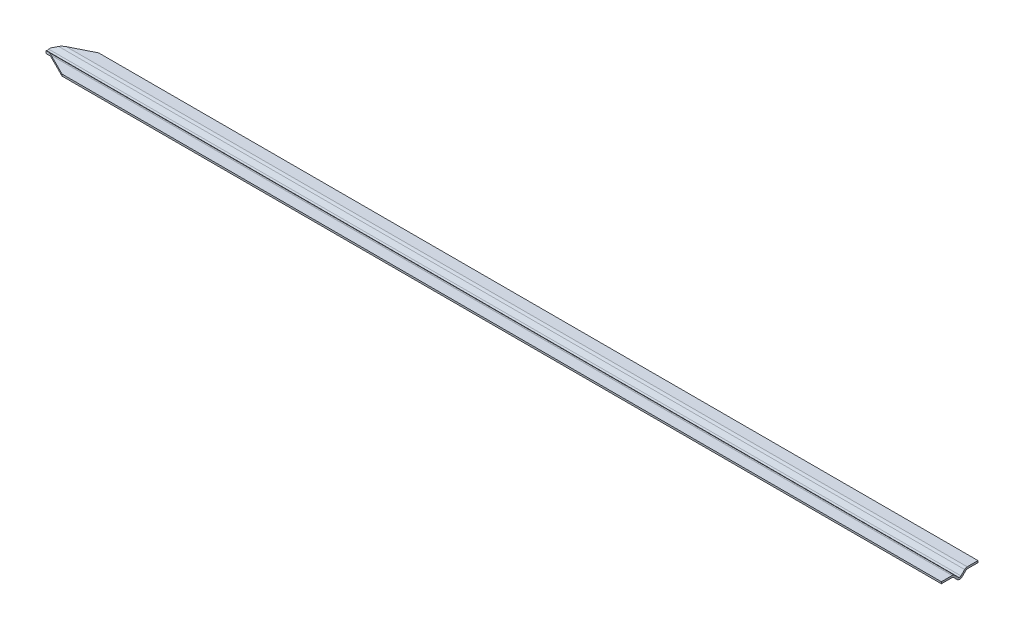
ISO-10303-21;
HEADER;
FILE_DESCRIPTION(('STEP AP214'),'2;1');
FILE_NAME('part.step','',(''),(''),'','','');
FILE_SCHEMA(('AUTOMOTIVE_DESIGN { 1 0 10303 214 1 1 1 1 }'));
ENDSEC;
DATA;
#1=APPLICATION_CONTEXT('core data for automotive mechanical design processes');
#2=APPLICATION_PROTOCOL_DEFINITION('international standard','automotive_design',2000,#1);
#3=PRODUCT_CONTEXT('',#1,'mechanical');
#4=PRODUCT('Part','Part','',(#3));
#5=PRODUCT_RELATED_PRODUCT_CATEGORY('part','',(#4));
#6=PRODUCT_DEFINITION_FORMATION('','',#4);
#7=PRODUCT_DEFINITION_CONTEXT('part definition',#1,'design');
#8=PRODUCT_DEFINITION('design','',#6,#7);
#9=PRODUCT_DEFINITION_SHAPE('','',#8);
#10=(LENGTH_UNIT() NAMED_UNIT(*) SI_UNIT(.MILLI.,.METRE.));
#11=(NAMED_UNIT(*) PLANE_ANGLE_UNIT() SI_UNIT($,.RADIAN.));
#12=(NAMED_UNIT(*) SI_UNIT($,.STERADIAN.) SOLID_ANGLE_UNIT());
#13=UNCERTAINTY_MEASURE_WITH_UNIT(LENGTH_MEASURE(1.E-05),#10,'distance_accuracy_value','');
#14=(GEOMETRIC_REPRESENTATION_CONTEXT(3) GLOBAL_UNCERTAINTY_ASSIGNED_CONTEXT((#13)) GLOBAL_UNIT_ASSIGNED_CONTEXT((#10,
#11,#12)) REPRESENTATION_CONTEXT('',''));
#15=CARTESIAN_POINT('',(0.,0.,0.));
#16=DIRECTION('',(0.,0.,1.));
#17=DIRECTION('',(1.,0.,0.));
#18=AXIS2_PLACEMENT_3D('',#15,#16,#17);
#19=CARTESIAN_POINT('',(-500.,0.,-20.));
#20=DIRECTION('',(0.,0.,-1.));
#21=DIRECTION('',(1.,0.,0.));
#22=AXIS2_PLACEMENT_3D('',#19,#20,#21);
#23=PLANE('',#22);
#24=DIRECTION('',(1.,0.,0.));
#25=VECTOR('',#24,1.);
#26=CARTESIAN_POINT('',(-500.,-1.,-20.));
#27=LINE('',#26,#25);
#28=CARTESIAN_POINT('',(-460.,-0.99999999999989,-20.));
#29=VERTEX_POINT('',#28);
#30=CARTESIAN_POINT('',(500.,-1.,-20.));
#31=VERTEX_POINT('',#30);
#32=EDGE_CURVE('E291',#29,#31,#27,.T.);
#33=ORIENTED_EDGE('',*,*,#32,.F.);
#34=DIRECTION('',(0.,-1.,0.));
#35=VECTOR('',#34,1.);
#36=CARTESIAN_POINT('',(-460.,1258.01941313971,-20.));
#37=LINE('',#36,#35);
#38=CARTESIAN_POINT('',(-460.,0.99999999999989,-20.));
#39=VERTEX_POINT('',#38);
#40=EDGE_CURVE('E184',#39,#29,#37,.T.);
#41=ORIENTED_EDGE('',*,*,#40,.F.);
#42=DIRECTION('',(1.,0.,0.));
#43=VECTOR('',#42,1.);
#44=CARTESIAN_POINT('',(-500.,1.,-20.));
#45=LINE('',#44,#43);
#46=CARTESIAN_POINT('',(500.,1.,-20.));
#47=VERTEX_POINT('',#46);
#48=EDGE_CURVE('E297',#39,#47,#45,.T.);
#49=ORIENTED_EDGE('',*,*,#48,.T.);
#50=DIRECTION('',(0.,-1.,0.));
#51=VECTOR('',#50,1.);
#52=CARTESIAN_POINT('',(500.,0.,-20.));
#53=LINE('',#52,#51);
#54=EDGE_CURVE('E299',#47,#31,#53,.T.);
#55=ORIENTED_EDGE('',*,*,#54,.T.);
#56=EDGE_LOOP('',(#33,#41,#49,#55));
#57=FACE_BOUND('',#56,.T.);
#58=ADVANCED_FACE('F37',(#57),#23,.T.);
#59=CARTESIAN_POINT('',(-500.,0.,20.));
#60=DIRECTION('',(0.,0.,-1.));
#61=DIRECTION('',(1.,0.,0.));
#62=AXIS2_PLACEMENT_3D('',#59,#60,#61);
#63=PLANE('',#62);
#64=DIRECTION('',(1.,0.,0.));
#65=VECTOR('',#64,1.);
#66=CARTESIAN_POINT('',(-500.,1.,20.));
#67=LINE('',#66,#65);
#68=CARTESIAN_POINT('',(-460.,0.99999999999989,20.));
#69=VERTEX_POINT('',#68);
#70=CARTESIAN_POINT('',(500.,1.,20.));
#71=VERTEX_POINT('',#70);
#72=EDGE_CURVE('E281',#69,#71,#67,.T.);
#73=ORIENTED_EDGE('',*,*,#72,.F.);
#74=DIRECTION('',(0.,-1.,0.));
#75=VECTOR('',#74,1.);
#76=CARTESIAN_POINT('',(-460.,1258.01941313971,20.));
#77=LINE('',#76,#75);
#78=CARTESIAN_POINT('',(-460.,-0.99999999999989,20.));
#79=VERTEX_POINT('',#78);
#80=EDGE_CURVE('E282',#69,#79,#77,.T.);
#81=ORIENTED_EDGE('',*,*,#80,.T.);
#82=DIRECTION('',(1.,0.,0.));
#83=VECTOR('',#82,1.);
#84=CARTESIAN_POINT('',(-500.,-1.,20.));
#85=LINE('',#84,#83);
#86=CARTESIAN_POINT('',(500.,-1.,20.));
#87=VERTEX_POINT('',#86);
#88=EDGE_CURVE('E304',#79,#87,#85,.T.);
#89=ORIENTED_EDGE('',*,*,#88,.T.);
#90=DIRECTION('',(0.,-1.,0.));
#91=VECTOR('',#90,1.);
#92=CARTESIAN_POINT('',(500.,0.,20.));
#93=LINE('',#92,#91);
#94=EDGE_CURVE('E285',#71,#87,#93,.T.);
#95=ORIENTED_EDGE('',*,*,#94,.F.);
#96=EDGE_LOOP('',(#73,#81,#89,#95));
#97=FACE_BOUND('',#96,.T.);
#98=ADVANCED_FACE('F243',(#97),#63,.F.);
#99=CARTESIAN_POINT('',(-500.,-1.,20.));
#100=DIRECTION('',(0.,-1.,0.));
#101=DIRECTION('',(0.,0.,-1.));
#102=AXIS2_PLACEMENT_3D('',#99,#100,#101);
#103=PLANE('',#102);
#104=ORIENTED_EDGE('',*,*,#88,.F.);
#105=DIRECTION('',(-0.894427190999916,0.,-0.447213595499958));
#106=VECTOR('',#105,1.);
#107=CARTESIAN_POINT('',(-492.,-1.,4.));
#108=LINE('',#107,#106);
#109=CARTESIAN_POINT('',(-483.514718625761,-1.,8.24264068711927));
#110=VERTEX_POINT('',#109);
#111=EDGE_CURVE('E217',#79,#110,#108,.T.);
#112=ORIENTED_EDGE('',*,*,#111,.T.);
#113=DIRECTION('',(1.,0.,0.));
#114=VECTOR('',#113,1.);
#115=CARTESIAN_POINT('',(500.,-1.,8.24264068711927));
#116=LINE('',#115,#114);
#117=CARTESIAN_POINT('',(500.,-1.,8.24264068711927));
#118=VERTEX_POINT('',#117);
#119=EDGE_CURVE('E309',#110,#118,#116,.T.);
#120=ORIENTED_EDGE('',*,*,#119,.T.);
#121=DIRECTION('',(0.,0.,-1.));
#122=VECTOR('',#121,1.);
#123=CARTESIAN_POINT('',(500.,-1.,20.));
#124=LINE('',#123,#122);
#125=EDGE_CURVE('E355',#87,#118,#124,.T.);
#126=ORIENTED_EDGE('',*,*,#125,.F.);
#127=EDGE_LOOP('',(#104,#112,#120,#126));
#128=FACE_BOUND('',#127,.T.);
#129=ADVANCED_FACE('F239',(#128),#103,.T.);
#130=CARTESIAN_POINT('',(-500.,-0.707106781186547,7.70710678118653));
#131=DIRECTION('',(0.,-0.707106781186547,0.707106781186548));
#132=DIRECTION('',(0.,-0.707106781186548,-0.707106781186547));
#133=AXIS2_PLACEMENT_3D('',#130,#131,#132);
#134=PLANE('',#133);
#135=DIRECTION('',(1.,0.,0.));
#136=VECTOR('',#135,1.);
#137=CARTESIAN_POINT('',(-500.,-1.58578643762691,6.82842712474617));
#138=LINE('',#137,#136);
#139=CARTESIAN_POINT('',(500.,-1.58578643762691,6.82842712474617));
#140=VERTEX_POINT('',#139);
#141=CARTESIAN_POINT('',(-486.343145750508,-1.58578643762691,6.82842712474617));
#142=VERTEX_POINT('',#141);
#143=EDGE_CURVE('E311',#140,#142,#138,.F.);
#144=ORIENTED_EDGE('',*,*,#143,.T.);
#145=DIRECTION('',(-0.816496580927725,-0.408248290463864,-0.408248290463863));
#146=VECTOR('',#145,1.);
#147=CARTESIAN_POINT('',(-494.861928812542,-5.84517796864424,2.56903559372885));
#148=LINE('',#147,#146);
#149=CARTESIAN_POINT('',(-494.343145750508,-5.5857864376269,2.82842712474619));
#150=VERTEX_POINT('',#149);
#151=EDGE_CURVE('E212',#142,#150,#148,.T.);
#152=ORIENTED_EDGE('',*,*,#151,.T.);
#153=DIRECTION('',(1.,0.,0.));
#154=VECTOR('',#153,1.);
#155=CARTESIAN_POINT('',(-500.,-5.5857864376269,2.82842712474619));
#156=LINE('',#155,#154);
#157=CARTESIAN_POINT('',(500.,-5.5857864376269,2.82842712474619));
#158=VERTEX_POINT('',#157);
#159=EDGE_CURVE('E326',#150,#158,#156,.T.);
#160=ORIENTED_EDGE('',*,*,#159,.T.);
#161=DIRECTION('',(0.,-0.707106781186548,-0.707106781186547));
#162=VECTOR('',#161,1.);
#163=CARTESIAN_POINT('',(500.,-0.707106781186547,7.70710678118653));
#164=LINE('',#163,#162);
#165=EDGE_CURVE('E358',#140,#158,#164,.T.);
#166=ORIENTED_EDGE('',*,*,#165,.F.);
#167=EDGE_LOOP('',(#144,#152,#160,#166));
#168=FACE_BOUND('',#167,.T.);
#169=ADVANCED_FACE('F242',(#168),#134,.T.);
#170=CARTESIAN_POINT('',(-500.,-7.70710678118655,-0.707106781186548));
#171=DIRECTION('',(0.,-0.707106781186547,-0.707106781186548));
#172=DIRECTION('',(0.,0.707106781186548,-0.707106781186547));
#173=AXIS2_PLACEMENT_3D('',#170,#171,#172);
#174=PLANE('',#173);
#175=DIRECTION('',(1.,0.,0.));
#176=VECTOR('',#175,1.);
#177=CARTESIAN_POINT('',(-500.,-5.5857864376269,-2.82842712474619));
#178=LINE('',#177,#176);
#179=CARTESIAN_POINT('',(500.,-5.5857864376269,-2.82842712474619));
#180=VERTEX_POINT('',#179);
#181=CARTESIAN_POINT('',(-494.343145750508,-5.5857864376269,-2.82842712474619));
#182=VERTEX_POINT('',#181);
#183=EDGE_CURVE('E333',#180,#182,#178,.F.);
#184=ORIENTED_EDGE('',*,*,#183,.T.);
#185=DIRECTION('',(0.816496580927725,0.408248290463864,-0.408248290463863));
#186=VECTOR('',#185,1.);
#187=CARTESIAN_POINT('',(-499.528595479209,-8.17851130197758,-0.235702260395514));
#188=LINE('',#187,#186);
#189=CARTESIAN_POINT('',(-486.343145750508,-1.58578643762691,-6.82842712474617));
#190=VERTEX_POINT('',#189);
#191=EDGE_CURVE('E194',#182,#190,#188,.T.);
#192=ORIENTED_EDGE('',*,*,#191,.T.);
#193=DIRECTION('',(1.,0.,0.));
#194=VECTOR('',#193,1.);
#195=CARTESIAN_POINT('',(500.,-1.58578643762691,-6.82842712474617));
#196=LINE('',#195,#194);
#197=CARTESIAN_POINT('',(500.,-1.58578643762691,-6.82842712474617));
#198=VERTEX_POINT('',#197);
#199=EDGE_CURVE('E314',#190,#198,#196,.T.);
#200=ORIENTED_EDGE('',*,*,#199,.T.);
#201=DIRECTION('',(0.,0.707106781186548,-0.707106781186547));
#202=VECTOR('',#201,1.);
#203=CARTESIAN_POINT('',(500.,-7.70710678118655,-0.707106781186548));
#204=LINE('',#203,#202);
#205=EDGE_CURVE('E361',#180,#198,#204,.T.);
#206=ORIENTED_EDGE('',*,*,#205,.F.);
#207=EDGE_LOOP('',(#184,#192,#200,#206));
#208=FACE_BOUND('',#207,.T.);
#209=ADVANCED_FACE('F247',(#208),#174,.T.);
#210=CARTESIAN_POINT('',(-500.,-1.,-6.99999999999998));
#211=DIRECTION('',(0.,-1.,0.));
#212=DIRECTION('',(0.,0.,-1.));
#213=AXIS2_PLACEMENT_3D('',#210,#211,#212);
#214=PLANE('',#213);
#215=DIRECTION('',(1.,0.,0.));
#216=VECTOR('',#215,1.);
#217=CARTESIAN_POINT('',(-500.,-1.,-8.24264068711927));
#218=LINE('',#217,#216);
#219=CARTESIAN_POINT('',(500.,-1.,-8.24264068711927));
#220=VERTEX_POINT('',#219);
#221=CARTESIAN_POINT('',(-483.514718625761,-1.,-8.24264068711927));
#222=VERTEX_POINT('',#221);
#223=EDGE_CURVE('E316',#220,#222,#218,.F.);
#224=ORIENTED_EDGE('',*,*,#223,.T.);
#225=DIRECTION('',(0.894427190999916,0.,-0.447213595499958));
#226=VECTOR('',#225,1.);
#227=CARTESIAN_POINT('',(-497.2,-1.,-1.4));
#228=LINE('',#227,#226);
#229=EDGE_CURVE('E202',#222,#29,#228,.T.);
#230=ORIENTED_EDGE('',*,*,#229,.T.);
#231=ORIENTED_EDGE('',*,*,#32,.T.);
#232=DIRECTION('',(0.,0.,-1.));
#233=VECTOR('',#232,1.);
#234=CARTESIAN_POINT('',(500.,-1.,-6.99999999999998));
#235=LINE('',#234,#233);
#236=EDGE_CURVE('E287',#220,#31,#235,.T.);
#237=ORIENTED_EDGE('',*,*,#236,.F.);
#238=EDGE_LOOP('',(#224,#230,#231,#237));
#239=FACE_BOUND('',#238,.T.);
#240=ADVANCED_FACE('F251',(#239),#214,.T.);
#241=CARTESIAN_POINT('',(-500.,1.,20.));
#242=DIRECTION('',(0.,-1.,0.));
#243=DIRECTION('',(0.,0.,-1.));
#244=AXIS2_PLACEMENT_3D('',#241,#242,#243);
#245=PLANE('',#244);
#246=DIRECTION('',(-0.894427190999916,0.,-0.447213595499958));
#247=VECTOR('',#246,1.);
#248=CARTESIAN_POINT('',(-492.,1.,4.));
#249=LINE('',#248,#247);
#250=CARTESIAN_POINT('',(-483.514718625761,1.,8.24264068711927));
#251=VERTEX_POINT('',#250);
#252=EDGE_CURVE('E207',#69,#251,#249,.T.);
#253=ORIENTED_EDGE('',*,*,#252,.F.);
#254=ORIENTED_EDGE('',*,*,#72,.T.);
#255=DIRECTION('',(0.,0.,-1.));
#256=VECTOR('',#255,1.);
#257=CARTESIAN_POINT('',(500.,1.,20.));
#258=LINE('',#257,#256);
#259=CARTESIAN_POINT('',(500.,1.,8.24264068711927));
#260=VERTEX_POINT('',#259);
#261=EDGE_CURVE('E288',#71,#260,#258,.T.);
#262=ORIENTED_EDGE('',*,*,#261,.T.);
#263=DIRECTION('',(1.,0.,0.));
#264=VECTOR('',#263,1.);
#265=CARTESIAN_POINT('',(-500.,1.,8.24264068711927));
#266=LINE('',#265,#264);
#267=EDGE_CURVE('E338',#260,#251,#266,.F.);
#268=ORIENTED_EDGE('',*,*,#267,.T.);
#269=EDGE_LOOP('',(#253,#254,#262,#268));
#270=FACE_BOUND('',#269,.T.);
#271=ADVANCED_FACE('F255',(#270),#245,.F.);
#272=CARTESIAN_POINT('',(-500.,0.707106781186547,6.29289321881343));
#273=DIRECTION('',(0.,-0.707106781186547,0.707106781186548));
#274=DIRECTION('',(0.,-0.707106781186548,-0.707106781186547));
#275=AXIS2_PLACEMENT_3D('',#272,#273,#274);
#276=PLANE('',#275);
#277=CARTESIAN_POINT('',(-493.291796067501,-5.58578643762697,0.));
#278=DIRECTION('',(0.,-0.707106781186547,0.707106781186548));
#279=DIRECTION('',(0.,-0.707106781186548,-0.707106781186547));
#280=AXIS2_PLACEMENT_3D('',#277,#278,#279);
#281=ELLIPSE('',#280,4.24264068711933,3.00000000000003);
#282=CARTESIAN_POINT('',(-494.633436854001,-2.90250486462728,2.68328157299975));
#283=VERTEX_POINT('',#282);
#284=CARTESIAN_POINT('',(-495.937547378565,-4.1715728752538,1.4142135623731));
#285=VERTEX_POINT('',#284);
#286=EDGE_CURVE('E179',#283,#285,#281,.T.);
#287=ORIENTED_EDGE('',*,*,#286,.F.);
#288=DIRECTION('',(-0.816496580927725,-0.408248290463864,-0.408248290463863));
#289=VECTOR('',#288,1.);
#290=CARTESIAN_POINT('',(-495.804737854124,-3.48815536468908,2.09763107293781));
#291=LINE('',#290,#289);
#292=CARTESIAN_POINT('',(-489.171572875254,-0.171572875253814,5.41421356237308));
#293=VERTEX_POINT('',#292);
#294=EDGE_CURVE('E205',#293,#283,#291,.T.);
#295=ORIENTED_EDGE('',*,*,#294,.F.);
#296=DIRECTION('',(1.,0.,0.));
#297=VECTOR('',#296,1.);
#298=CARTESIAN_POINT('',(-500.,-0.171572875253814,5.41421356237308));
#299=LINE('',#298,#297);
#300=CARTESIAN_POINT('',(500.,-0.171572875253814,5.41421356237308));
#301=VERTEX_POINT('',#300);
#302=EDGE_CURVE('E336',#293,#301,#299,.T.);
#303=ORIENTED_EDGE('',*,*,#302,.T.);
#304=DIRECTION('',(0.,-0.707106781186548,-0.707106781186547));
#305=VECTOR('',#304,1.);
#306=CARTESIAN_POINT('',(500.,0.707106781186547,6.29289321881343));
#307=LINE('',#306,#305);
#308=CARTESIAN_POINT('',(500.,-4.1715728752538,1.4142135623731));
#309=VERTEX_POINT('',#308);
#310=EDGE_CURVE('E293',#301,#309,#307,.T.);
#311=ORIENTED_EDGE('',*,*,#310,.T.);
#312=DIRECTION('',(1.,0.,0.));
#313=VECTOR('',#312,1.);
#314=CARTESIAN_POINT('',(-500.,-4.1715728752538,1.4142135623731));
#315=LINE('',#314,#313);
#316=EDGE_CURVE('E306',#309,#285,#315,.F.);
#317=ORIENTED_EDGE('',*,*,#316,.T.);
#318=EDGE_LOOP('',(#287,#295,#303,#311,#317));
#319=FACE_BOUND('',#318,.T.);
#320=ADVANCED_FACE('F259',(#319),#276,.F.);
#321=CARTESIAN_POINT('',(-500.,-6.29289321881345,0.707106781186548));
#322=DIRECTION('',(0.,-0.707106781186547,-0.707106781186548));
#323=DIRECTION('',(0.,0.707106781186548,-0.707106781186547));
#324=AXIS2_PLACEMENT_3D('',#321,#322,#323);
#325=PLANE('',#324);
#326=DIRECTION('',(0.816496580927725,0.408248290463864,-0.408248290463863));
#327=VECTOR('',#326,1.);
#328=CARTESIAN_POINT('',(-500.471404520791,-5.82148869802242,0.235702260395519));
#329=LINE('',#328,#327);
#330=CARTESIAN_POINT('',(-494.633436854,-2.90250486462718,-2.68328157299977));
#331=VERTEX_POINT('',#330);
#332=CARTESIAN_POINT('',(-489.171572875254,-0.171572875253814,-5.41421356237308));
#333=VERTEX_POINT('',#332);
#334=EDGE_CURVE('E58',#331,#333,#329,.T.);
#335=ORIENTED_EDGE('',*,*,#334,.F.);
#336=CARTESIAN_POINT('',(-493.291796067501,-5.58578643762697,0.));
#337=DIRECTION('',(0.,-0.707106781186547,-0.707106781186548));
#338=DIRECTION('',(0.,-0.707106781186548,0.707106781186547));
#339=AXIS2_PLACEMENT_3D('',#336,#337,#338);
#340=ELLIPSE('',#339,4.24264068711933,3.00000000000003);
#341=CARTESIAN_POINT('',(-495.937547378565,-4.1715728752538,-1.4142135623731));
#342=VERTEX_POINT('',#341);
#343=EDGE_CURVE('E171',#342,#331,#340,.T.);
#344=ORIENTED_EDGE('',*,*,#343,.F.);
#345=DIRECTION('',(1.,0.,0.));
#346=VECTOR('',#345,1.);
#347=CARTESIAN_POINT('',(500.,-4.1715728752538,-1.4142135623731));
#348=LINE('',#347,#346);
#349=CARTESIAN_POINT('',(500.,-4.1715728752538,-1.4142135623731));
#350=VERTEX_POINT('',#349);
#351=EDGE_CURVE('E302',#342,#350,#348,.T.);
#352=ORIENTED_EDGE('',*,*,#351,.T.);
#353=DIRECTION('',(0.,0.707106781186548,-0.707106781186547));
#354=VECTOR('',#353,1.);
#355=CARTESIAN_POINT('',(500.,-6.29289321881345,0.707106781186548));
#356=LINE('',#355,#354);
#357=CARTESIAN_POINT('',(500.,-0.171572875253814,-5.41421356237308));
#358=VERTEX_POINT('',#357);
#359=EDGE_CURVE('E368',#350,#358,#356,.T.);
#360=ORIENTED_EDGE('',*,*,#359,.T.);
#361=DIRECTION('',(1.,0.,0.));
#362=VECTOR('',#361,1.);
#363=CARTESIAN_POINT('',(-500.,-0.171572875253814,-5.41421356237308));
#364=LINE('',#363,#362);
#365=EDGE_CURVE('E191',#358,#333,#364,.F.);
#366=ORIENTED_EDGE('',*,*,#365,.T.);
#367=EDGE_LOOP('',(#335,#344,#352,#360,#366));
#368=FACE_BOUND('',#367,.T.);
#369=ADVANCED_FACE('F188',(#368),#325,.F.);
#370=CARTESIAN_POINT('',(-500.,1.,-6.99999999999998));
#371=DIRECTION('',(0.,-1.,0.));
#372=DIRECTION('',(0.,0.,-1.));
#373=AXIS2_PLACEMENT_3D('',#370,#371,#372);
#374=PLANE('',#373);
#375=DIRECTION('',(0.894427190999916,0.,-0.447213595499958));
#376=VECTOR('',#375,1.);
#377=CARTESIAN_POINT('',(-497.2,1.,-1.4));
#378=LINE('',#377,#376);
#379=CARTESIAN_POINT('',(-483.514718625761,1.,-8.24264068711927));
#380=VERTEX_POINT('',#379);
#381=EDGE_CURVE('E192',#380,#39,#378,.T.);
#382=ORIENTED_EDGE('',*,*,#381,.F.);
#383=DIRECTION('',(1.,0.,0.));
#384=VECTOR('',#383,1.);
#385=CARTESIAN_POINT('',(-500.,1.,-8.24264068711927));
#386=LINE('',#385,#384);
#387=CARTESIAN_POINT('',(500.,1.,-8.24264068711927));
#388=VERTEX_POINT('',#387);
#389=EDGE_CURVE('E341',#380,#388,#386,.T.);
#390=ORIENTED_EDGE('',*,*,#389,.T.);
#391=DIRECTION('',(0.,0.,-1.));
#392=VECTOR('',#391,1.);
#393=CARTESIAN_POINT('',(500.,1.,-6.99999999999998));
#394=LINE('',#393,#392);
#395=EDGE_CURVE('E369',#388,#47,#394,.T.);
#396=ORIENTED_EDGE('',*,*,#395,.T.);
#397=ORIENTED_EDGE('',*,*,#48,.F.);
#398=EDGE_LOOP('',(#382,#390,#396,#397));
#399=FACE_BOUND('',#398,.T.);
#400=ADVANCED_FACE('F266',(#399),#374,.F.);
#401=CARTESIAN_POINT('',(-500.,-2.75735931288071,0.));
#402=DIRECTION('',(-1.,0.,0.));
#403=DIRECTION('',(0.,0.,1.));
#404=AXIS2_PLACEMENT_3D('',#401,#402,#403);
#405=CYLINDRICAL_SURFACE('',#404,2.);
#406=CARTESIAN_POINT('',(-495.937547378565,-4.1715728752538,1.4142135623731));
#407=CARTESIAN_POINT('',(-495.957723297161,-4.20930799790388,1.37646808999392));
#408=CARTESIAN_POINT('',(-495.977684740593,-4.2455848982313,1.33717838352032));
#409=CARTESIAN_POINT('',(-496.016800254544,-4.31507554483248,1.25554961252144));
#410=CARTESIAN_POINT('',(-496.035953733113,-4.34828706573443,1.21320837177433));
#411=CARTESIAN_POINT('',(-496.091833613438,-4.44343906416258,1.08117595074418));
#412=CARTESIAN_POINT('',(-496.126703994421,-4.50039646375513,0.986973412628392));
#413=CARTESIAN_POINT('',(-496.188398607626,-4.59904143321139,0.787790797351582));
#414=CARTESIAN_POINT('',(-496.215182926196,-4.64065347329479,0.682760583144709));
#415=CARTESIAN_POINT('',(-496.257531785287,-4.70574424617022,0.46538391593548));
#416=CARTESIAN_POINT('',(-496.273138038778,-4.7292904186943,0.353066387184212));
#417=CARTESIAN_POINT('',(-496.290287594897,-4.75511482251872,0.138635844907319));
#418=CARTESIAN_POINT('',(-496.293284438429,-4.75959209063838,0.0369007007344669));
#419=CARTESIAN_POINT('',(-496.288920919191,-4.75304606859646,-0.165894493081308));
#420=CARTESIAN_POINT('',(-496.281556767717,-4.74201710827607,-0.266954282187833));
#421=CARTESIAN_POINT('',(-496.258104270704,-4.7064984955943,-0.457816498489173));
#422=CARTESIAN_POINT('',(-496.24269225465,-4.6830505850522,-0.547902087008158));
#423=CARTESIAN_POINT('',(-496.204832212706,-4.62451689059015,-0.722648032734442));
#424=CARTESIAN_POINT('',(-496.18238085284,-4.58942559166536,-0.807305796281815));
#425=CARTESIAN_POINT('',(-496.129908164917,-4.5055130112524,-0.976533840593393));
#426=CARTESIAN_POINT('',(-496.099410621093,-4.45578858188332,-1.06050409933128));
#427=CARTESIAN_POINT('',(-496.034228189167,-4.34572454412712,-1.21918489677028));
#428=CARTESIAN_POINT('',(-495.99954825886,-4.28539746603746,-1.29390619026288));
#429=CARTESIAN_POINT('',(-495.955202633419,-4.20439386422946,-1.38081153760543));
#430=CARTESIAN_POINT('',(-495.946393690875,-4.18812034760624,-1.39766586340613));
#431=CARTESIAN_POINT('',(-495.937547378565,-4.1715728752538,-1.4142135623731));
#432=B_SPLINE_CURVE_WITH_KNOTS('',3,(#406,#407,#408,#409,#410,#411,#412,#413,#414,#415,#416,
#417,#418,#419,#420,#421,#422,#423,#424,#425,#426,#427,#428,#429,#430,#431),.UNSPECIFIED.,.F.,
.F.,(4,2,2,2,2,2,2,2,2,2,2,2,4),(0.,0.171094016347221,0.342311280518857,0.686993291106532,
1.03334987023094,1.37840712632449,1.6823675563354,1.98643916439638,2.2683067262671,
2.55030798851123,2.85590511480023,3.16114348306743,3.23621656431459),.UNSPECIFIED.);
#433=EDGE_CURVE('E176',#285,#342,#432,.T.);
#434=ORIENTED_EDGE('',*,*,#433,.F.);
#435=ORIENTED_EDGE('',*,*,#316,.F.);
#436=CARTESIAN_POINT('',(500.,-2.75735931288071,0.));
#437=DIRECTION('',(-1.,0.,0.));
#438=DIRECTION('',(0.,0.,1.));
#439=AXIS2_PLACEMENT_3D('',#436,#437,#438);
#440=CIRCLE('',#439,2.);
#441=EDGE_CURVE('E319',#350,#309,#440,.T.);
#442=ORIENTED_EDGE('',*,*,#441,.F.);
#443=ORIENTED_EDGE('',*,*,#351,.F.);
#444=EDGE_LOOP('',(#434,#435,#442,#443));
#445=FACE_BOUND('',#444,.T.);
#446=ADVANCED_FACE('F226',(#445),#405,.F.);
#447=CARTESIAN_POINT('',(-500.,-3.,8.24264068711927));
#448=DIRECTION('',(-1.,0.,0.));
#449=DIRECTION('',(0.,0.,1.));
#450=AXIS2_PLACEMENT_3D('',#447,#448,#449);
#451=CYLINDRICAL_SURFACE('',#450,2.);
#452=CARTESIAN_POINT('',(-483.514718625761,-3.,8.24264068711927));
#453=DIRECTION('',(-0.447213595499958,0.,0.894427190999916));
#454=DIRECTION('',(-0.894427190999916,0.,-0.447213595499958));
#455=AXIS2_PLACEMENT_3D('',#452,#453,#454);
#456=ELLIPSE('',#455,4.47213595499958,2.);
#457=EDGE_CURVE('E215',#142,#110,#456,.F.);
#458=ORIENTED_EDGE('',*,*,#457,.F.);
#459=ORIENTED_EDGE('',*,*,#143,.F.);
#460=CARTESIAN_POINT('',(500.,-3.,8.24264068711927));
#461=DIRECTION('',(-1.,0.,0.));
#462=DIRECTION('',(0.,0.,1.));
#463=AXIS2_PLACEMENT_3D('',#460,#461,#462);
#464=CIRCLE('',#463,2.);
#465=EDGE_CURVE('E322',#118,#140,#464,.T.);
#466=ORIENTED_EDGE('',*,*,#465,.F.);
#467=ORIENTED_EDGE('',*,*,#119,.F.);
#468=EDGE_LOOP('',(#458,#459,#466,#467));
#469=FACE_BOUND('',#468,.T.);
#470=ADVANCED_FACE('F398',(#469),#451,.F.);
#471=CARTESIAN_POINT('',(-500.,-3.,-8.24264068711927));
#472=DIRECTION('',(-1.,0.,0.));
#473=DIRECTION('',(0.,0.,1.));
#474=AXIS2_PLACEMENT_3D('',#471,#472,#473);
#475=CYLINDRICAL_SURFACE('',#474,2.);
#476=CARTESIAN_POINT('',(-483.514718625761,-3.,-8.24264068711927));
#477=DIRECTION('',(-0.447213595499958,0.,-0.894427190999916));
#478=DIRECTION('',(-0.894427190999916,0.,0.447213595499958));
#479=AXIS2_PLACEMENT_3D('',#476,#477,#478);
#480=ELLIPSE('',#479,4.47213595499958,2.);
#481=EDGE_CURVE('E200',#222,#190,#480,.F.);
#482=ORIENTED_EDGE('',*,*,#481,.F.);
#483=ORIENTED_EDGE('',*,*,#223,.F.);
#484=CARTESIAN_POINT('',(500.,-3.,-8.24264068711927));
#485=DIRECTION('',(-1.,0.,0.));
#486=DIRECTION('',(0.,0.,1.));
#487=AXIS2_PLACEMENT_3D('',#484,#485,#486);
#488=CIRCLE('',#487,2.);
#489=EDGE_CURVE('E324',#198,#220,#488,.T.);
#490=ORIENTED_EDGE('',*,*,#489,.F.);
#491=ORIENTED_EDGE('',*,*,#199,.F.);
#492=EDGE_LOOP('',(#482,#483,#490,#491));
#493=FACE_BOUND('',#492,.T.);
#494=ADVANCED_FACE('F404',(#493),#475,.F.);
#495=CARTESIAN_POINT('',(-500.,-2.75735931288071,0.));
#496=DIRECTION('',(1.,0.,0.));
#497=DIRECTION('',(0.,0.,-1.));
#498=AXIS2_PLACEMENT_3D('',#495,#496,#497);
#499=CYLINDRICAL_SURFACE('',#498,4.);
#500=CARTESIAN_POINT('',(-494.633436854,-5.72383870771893,2.68328157299977));
#501=CARTESIAN_POINT('',(-494.715002622562,-5.76077218313878,2.64247211538646));
#502=CARTESIAN_POINT('',(-494.794146883328,-5.79919971721772,2.59827589772774));
#503=CARTESIAN_POINT('',(-494.947506266393,-5.87777088265218,2.50335625454541));
#504=CARTESIAN_POINT('',(-495.021722064006,-5.91791427765064,2.45263372608796));
#505=CARTESIAN_POINT('',(-495.165819958761,-5.99902700188727,2.34440136762551));
#506=CARTESIAN_POINT('',(-495.235655959698,-6.04000053113003,2.28683344458378));
#507=CARTESIAN_POINT('',(-495.370051406592,-6.12132707530982,2.16542318207985));
#508=CARTESIAN_POINT('',(-495.434610556632,-6.1616800553447,2.10158049118149));
#509=CARTESIAN_POINT('',(-495.558223153258,-6.24081116174313,1.96764409665909));
#510=CARTESIAN_POINT('',(-495.617268068992,-6.27958679721958,1.89754102516189));
#511=CARTESIAN_POINT('',(-495.729273485981,-6.35451994668048,1.75133727143329));
#512=CARTESIAN_POINT('',(-495.782235079292,-6.39067793014406,1.67523766982571));
#513=CARTESIAN_POINT('',(-495.881307295705,-6.4592908221034,1.51758329930309));
#514=CARTESIAN_POINT('',(-495.92744409499,-6.49175976234274,1.43605121027774));
#515=CARTESIAN_POINT('',(-496.012409628782,-6.55220439038304,1.26773535452009));
#516=CARTESIAN_POINT('',(-496.05124152706,-6.58018202260712,1.18095388293));
#517=CARTESIAN_POINT('',(-496.135948537419,-6.6416888677481,0.96412761308472));
#518=CARTESIAN_POINT('',(-496.177627300975,-6.67240064866376,0.831579057875664));
#519=CARTESIAN_POINT('',(-496.242433079159,-6.72041175583255,0.559693177473482));
#520=CARTESIAN_POINT('',(-496.265567527363,-6.7377164562842,0.420358596273561));
#521=CARTESIAN_POINT('',(-496.291957765163,-6.757470661654,0.138320834523591));
#522=CARTESIAN_POINT('',(-496.295155435835,-6.75987673452919,-0.00439097847765716));
#523=CARTESIAN_POINT('',(-496.281295268575,-6.7494872137728,-0.28826268828161));
#524=CARTESIAN_POINT('',(-496.264235447145,-6.73669013153407,-0.429422431748479));
#525=CARTESIAN_POINT('',(-496.212143603856,-6.69793610376558,-0.699780572691161));
#526=CARTESIAN_POINT('',(-496.177945577119,-6.6725904433339,-0.829231704526414));
#527=CARTESIAN_POINT('',(-496.093756339135,-6.61095002903264,-1.0800632229783));
#528=CARTESIAN_POINT('',(-496.043763595678,-6.57465421292761,-1.20144282520998));
#529=CARTESIAN_POINT('',(-495.924318037764,-6.48941609016781,-1.44571330438409));
#530=CARTESIAN_POINT('',(-495.85344002044,-6.43958401698732,-1.56759059293953));
#531=CARTESIAN_POINT('',(-495.697162646992,-6.33262684939705,-1.798238644975));
#532=CARTESIAN_POINT('',(-495.611743597069,-6.27549189074723,-1.90699128699305));
#533=CARTESIAN_POINT('',(-495.410231087528,-6.14567590720773,-2.1305185131452));
#534=CARTESIAN_POINT('',(-495.291404662496,-6.07213718914377,-2.24232540299463));
#535=CARTESIAN_POINT('',(-495.037400643307,-5.92537574070999,-2.44525161857304));
#536=CARTESIAN_POINT('',(-494.902256321314,-5.85215267239934,-2.53641198589232));
#537=CARTESIAN_POINT('',(-494.717964396449,-5.7628056608574,-2.63974601060945));
#538=CARTESIAN_POINT('',(-494.676023347442,-5.74311417997336,-2.66198050761981));
#539=CARTESIAN_POINT('',(-494.633436854,-5.72383870771896,-2.68328157299981));
#540=B_SPLINE_CURVE_WITH_KNOTS('',3,(#500,#501,#502,#503,#504,#505,#506,#507,#508,#509,#510,
#511,#512,#513,#514,#515,#516,#517,#518,#519,#520,#521,#522,#523,#524,#525,#526,#527,#528,#529,
#530,#531,#532,#533,#534,#535,#536,#537,#538,#539),.UNSPECIFIED.,.F.,.F.,(4,2,2,2,2,2,2,2,2,2,2,
2,2,2,2,2,2,2,2,4),(0.,0.295040353006456,0.590040194835903,0.887751163934453,1.18547881669246,
1.48365969560421,1.78178696223152,2.07873935185104,2.37556283305606,2.80052502760093,
3.22531678873115,3.65134630960944,4.0774175483324,4.48451879106474,4.89165953793781,
5.33862624186996,5.78620318740336,6.32113942696227,6.85500278922134,7.00912882715795),.UNSPECIFIED.);
#541=CARTESIAN_POINT('',(-494.633436854,-5.72383870771898,2.68328157299977));
#542=VERTEX_POINT('',#541);
#543=CARTESIAN_POINT('',(-494.633436854,-5.72383870771893,-2.68328157299977));
#544=VERTEX_POINT('',#543);
#545=EDGE_CURVE('E11',#542,#544,#540,.T.);
#546=ORIENTED_EDGE('',*,*,#545,.T.);
#547=CARTESIAN_POINT('',(-500.,-2.75735931288071,0.));
#548=DIRECTION('',(-0.447213595499958,0.,-0.894427190999916));
#549=DIRECTION('',(0.894427190999916,0.,-0.447213595499958));
#550=AXIS2_PLACEMENT_3D('',#547,#548,#549);
#551=ELLIPSE('',#550,8.94427190999915,4.);
#552=EDGE_CURVE('E183',#544,#182,#551,.F.);
#553=ORIENTED_EDGE('',*,*,#552,.T.);
#554=ORIENTED_EDGE('',*,*,#183,.F.);
#555=CARTESIAN_POINT('',(500.,-2.75735931288071,0.));
#556=DIRECTION('',(-1.,0.,0.));
#557=DIRECTION('',(0.,0.,1.));
#558=AXIS2_PLACEMENT_3D('',#555,#556,#557);
#559=CIRCLE('',#558,4.);
#560=EDGE_CURVE('E331',#158,#180,#559,.F.);
#561=ORIENTED_EDGE('',*,*,#560,.F.);
#562=ORIENTED_EDGE('',*,*,#159,.F.);
#563=CARTESIAN_POINT('',(-500.,-2.75735931288071,0.));
#564=DIRECTION('',(-0.447213595499958,0.,0.894427190999916));
#565=DIRECTION('',(0.894427190999916,0.,0.447213595499958));
#566=AXIS2_PLACEMENT_3D('',#563,#564,#565);
#567=ELLIPSE('',#566,8.94427190999915,4.);
#568=EDGE_CURVE('E209',#150,#542,#567,.F.);
#569=ORIENTED_EDGE('',*,*,#568,.T.);
#570=EDGE_LOOP('',(#546,#553,#554,#561,#562,#569));
#571=FACE_BOUND('',#570,.T.);
#572=ADVANCED_FACE('F391',(#571),#499,.T.);
#573=CARTESIAN_POINT('',(-500.,-3.,8.24264068711927));
#574=DIRECTION('',(1.,0.,0.));
#575=DIRECTION('',(0.,0.,-1.));
#576=AXIS2_PLACEMENT_3D('',#573,#574,#575);
#577=CYLINDRICAL_SURFACE('',#576,4.);
#578=ORIENTED_EDGE('',*,*,#302,.F.);
#579=CARTESIAN_POINT('',(-483.514718625761,-3.,8.24264068711927));
#580=DIRECTION('',(-0.447213595499958,0.,0.894427190999916));
#581=DIRECTION('',(0.894427190999916,0.,0.447213595499958));
#582=AXIS2_PLACEMENT_3D('',#579,#580,#581);
#583=ELLIPSE('',#582,8.94427190999915,4.);
#584=EDGE_CURVE('E51',#293,#251,#583,.F.);
#585=ORIENTED_EDGE('',*,*,#584,.T.);
#586=ORIENTED_EDGE('',*,*,#267,.F.);
#587=CARTESIAN_POINT('',(500.,-3.,8.24264068711927));
#588=DIRECTION('',(-1.,0.,0.));
#589=DIRECTION('',(0.,0.,1.));
#590=AXIS2_PLACEMENT_3D('',#587,#588,#589);
#591=CIRCLE('',#590,4.);
#592=EDGE_CURVE('E66',#301,#260,#591,.F.);
#593=ORIENTED_EDGE('',*,*,#592,.F.);
#594=EDGE_LOOP('',(#578,#585,#586,#593));
#595=FACE_BOUND('',#594,.T.);
#596=ADVANCED_FACE('F349',(#595),#577,.T.);
#597=CARTESIAN_POINT('',(-500.,-3.,-8.24264068711927));
#598=DIRECTION('',(1.,0.,0.));
#599=DIRECTION('',(0.,0.,-1.));
#600=AXIS2_PLACEMENT_3D('',#597,#598,#599);
#601=CYLINDRICAL_SURFACE('',#600,4.);
#602=ORIENTED_EDGE('',*,*,#389,.F.);
#603=CARTESIAN_POINT('',(-483.514718625761,-3.,-8.24264068711927));
#604=DIRECTION('',(-0.447213595499958,0.,-0.894427190999916));
#605=DIRECTION('',(0.894427190999916,0.,-0.447213595499958));
#606=AXIS2_PLACEMENT_3D('',#603,#604,#605);
#607=ELLIPSE('',#606,8.94427190999915,4.);
#608=EDGE_CURVE('E344',#380,#333,#607,.F.);
#609=ORIENTED_EDGE('',*,*,#608,.T.);
#610=ORIENTED_EDGE('',*,*,#365,.F.);
#611=CARTESIAN_POINT('',(500.,-3.,-8.24264068711927));
#612=DIRECTION('',(-1.,0.,0.));
#613=DIRECTION('',(0.,0.,1.));
#614=AXIS2_PLACEMENT_3D('',#611,#612,#613);
#615=CIRCLE('',#614,4.);
#616=EDGE_CURVE('E328',#388,#358,#615,.F.);
#617=ORIENTED_EDGE('',*,*,#616,.F.);
#618=EDGE_LOOP('',(#602,#609,#610,#617));
#619=FACE_BOUND('',#618,.T.);
#620=ADVANCED_FACE('F39',(#619),#601,.T.);
#621=CARTESIAN_POINT('',(500.,0.,20.));
#622=DIRECTION('',(-1.,0.,0.));
#623=DIRECTION('',(0.,0.,-1.));
#624=AXIS2_PLACEMENT_3D('',#621,#622,#623);
#625=PLANE('',#624);
#626=ORIENTED_EDGE('',*,*,#165,.T.);
#627=ORIENTED_EDGE('',*,*,#560,.T.);
#628=ORIENTED_EDGE('',*,*,#205,.T.);
#629=ORIENTED_EDGE('',*,*,#489,.T.);
#630=ORIENTED_EDGE('',*,*,#236,.T.);
#631=ORIENTED_EDGE('',*,*,#54,.F.);
#632=ORIENTED_EDGE('',*,*,#395,.F.);
#633=ORIENTED_EDGE('',*,*,#616,.T.);
#634=ORIENTED_EDGE('',*,*,#359,.F.);
#635=ORIENTED_EDGE('',*,*,#441,.T.);
#636=ORIENTED_EDGE('',*,*,#310,.F.);
#637=ORIENTED_EDGE('',*,*,#592,.T.);
#638=ORIENTED_EDGE('',*,*,#261,.F.);
#639=ORIENTED_EDGE('',*,*,#94,.T.);
#640=ORIENTED_EDGE('',*,*,#125,.T.);
#641=ORIENTED_EDGE('',*,*,#465,.T.);
#642=EDGE_LOOP('',(#626,#627,#628,#629,#630,#631,#632,#633,#634,#635,#636,#637,#638,#639,#640,#641));
#643=FACE_BOUND('',#642,.T.);
#644=ADVANCED_FACE('F235',(#643),#625,.F.);
#645=CARTESIAN_POINT('',(-493.291796067501,1258.01941313971,0.));
#646=DIRECTION('',(0.,-1.,0.));
#647=DIRECTION('',(0.,0.,-1.));
#648=AXIS2_PLACEMENT_3D('',#645,#646,#647);
#649=CYLINDRICAL_SURFACE('',#648,3.00000000000003);
#650=DIRECTION('',(0.,-1.,0.));
#651=VECTOR('',#650,1.);
#652=CARTESIAN_POINT('',(-494.633436854,1258.01941313971,2.68328157299977));
#653=LINE('',#652,#651);
#654=EDGE_CURVE('E185',#283,#542,#653,.T.);
#655=ORIENTED_EDGE('',*,*,#654,.F.);
#656=ORIENTED_EDGE('',*,*,#286,.T.);
#657=ORIENTED_EDGE('',*,*,#433,.T.);
#658=ORIENTED_EDGE('',*,*,#343,.T.);
#659=DIRECTION('',(0.,-1.,0.));
#660=VECTOR('',#659,1.);
#661=CARTESIAN_POINT('',(-494.633436854,1258.01941313971,-2.68328157299977));
#662=LINE('',#661,#660);
#663=EDGE_CURVE('E174',#331,#544,#662,.T.);
#664=ORIENTED_EDGE('',*,*,#663,.T.);
#665=ORIENTED_EDGE('',*,*,#545,.F.);
#666=EDGE_LOOP('',(#655,#656,#657,#658,#664,#665));
#667=FACE_BOUND('',#666,.T.);
#668=ADVANCED_FACE('F173',(#667),#649,.T.);
#669=CARTESIAN_POINT('',(-460.,1258.01941313971,20.));
#670=DIRECTION('',(-0.447213595499958,0.,0.894427190999916));
#671=DIRECTION('',(0.894427190999916,0.,0.447213595499958));
#672=AXIS2_PLACEMENT_3D('',#669,#670,#671);
#673=PLANE('',#672);
#674=ORIENTED_EDGE('',*,*,#111,.F.);
#675=ORIENTED_EDGE('',*,*,#80,.F.);
#676=ORIENTED_EDGE('',*,*,#252,.T.);
#677=ORIENTED_EDGE('',*,*,#584,.F.);
#678=ORIENTED_EDGE('',*,*,#294,.T.);
#679=ORIENTED_EDGE('',*,*,#654,.T.);
#680=ORIENTED_EDGE('',*,*,#568,.F.);
#681=ORIENTED_EDGE('',*,*,#151,.F.);
#682=ORIENTED_EDGE('',*,*,#457,.T.);
#683=EDGE_LOOP('',(#674,#675,#676,#677,#678,#679,#680,#681,#682));
#684=FACE_BOUND('',#683,.T.);
#685=ADVANCED_FACE('F234',(#684),#673,.T.);
#686=CARTESIAN_POINT('',(-494.633436854,1258.01941313971,-2.68328157299977));
#687=DIRECTION('',(-0.447213595499958,0.,-0.894427190999916));
#688=DIRECTION('',(-0.894427190999916,0.,0.447213595499958));
#689=AXIS2_PLACEMENT_3D('',#686,#687,#688);
#690=PLANE('',#689);
#691=ORIENTED_EDGE('',*,*,#229,.F.);
#692=ORIENTED_EDGE('',*,*,#481,.T.);
#693=ORIENTED_EDGE('',*,*,#191,.F.);
#694=ORIENTED_EDGE('',*,*,#552,.F.);
#695=ORIENTED_EDGE('',*,*,#663,.F.);
#696=ORIENTED_EDGE('',*,*,#334,.T.);
#697=ORIENTED_EDGE('',*,*,#608,.F.);
#698=ORIENTED_EDGE('',*,*,#381,.T.);
#699=ORIENTED_EDGE('',*,*,#40,.T.);
#700=EDGE_LOOP('',(#691,#692,#693,#694,#695,#696,#697,#698,#699));
#701=FACE_BOUND('',#700,.T.);
#702=ADVANCED_FACE('F181',(#701),#690,.T.);
#703=CLOSED_SHELL('',(#58,#98,#129,#169,#209,#240,#271,#320,#369,#400,#446,#470,#494,#572,#596,
#620,#644,#668,#685,#702));
#704=MANIFOLD_SOLID_BREP('B2',#703);
#705=ADVANCED_BREP_SHAPE_REPRESENTATION('',(#18,#704),#14);
#706=SHAPE_DEFINITION_REPRESENTATION(#9,#705);
ENDSEC;
END-ISO-10303-21;
